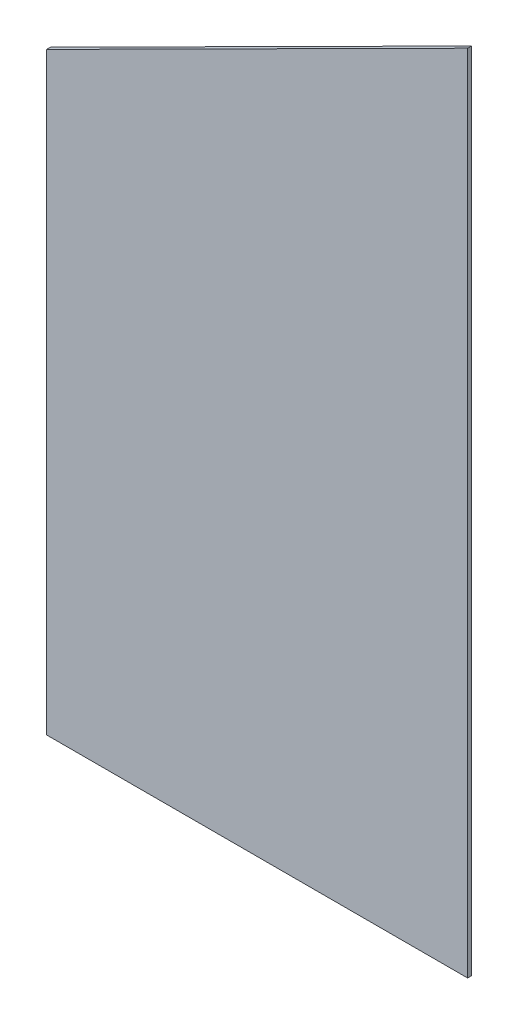
ISO-10303-21;
HEADER;
FILE_DESCRIPTION(('STEP AP214'),'2;1');
FILE_NAME('part.step','',(''),(''),'','','');
FILE_SCHEMA(('AUTOMOTIVE_DESIGN { 1 0 10303 214 1 1 1 1 }'));
ENDSEC;
DATA;
#1=APPLICATION_CONTEXT('core data for automotive mechanical design processes');
#2=APPLICATION_PROTOCOL_DEFINITION('international standard','automotive_design',2000,#1);
#3=PRODUCT_CONTEXT('',#1,'mechanical');
#4=PRODUCT('Part','Part','',(#3));
#5=PRODUCT_RELATED_PRODUCT_CATEGORY('part','',(#4));
#6=PRODUCT_DEFINITION_FORMATION('','',#4);
#7=PRODUCT_DEFINITION_CONTEXT('part definition',#1,'design');
#8=PRODUCT_DEFINITION('design','',#6,#7);
#9=PRODUCT_DEFINITION_SHAPE('','',#8);
#10=(LENGTH_UNIT() NAMED_UNIT(*) SI_UNIT(.MILLI.,.METRE.));
#11=(NAMED_UNIT(*) PLANE_ANGLE_UNIT() SI_UNIT($,.RADIAN.));
#12=(NAMED_UNIT(*) SI_UNIT($,.STERADIAN.) SOLID_ANGLE_UNIT());
#13=UNCERTAINTY_MEASURE_WITH_UNIT(LENGTH_MEASURE(1.E-05),#10,'distance_accuracy_value','');
#14=(GEOMETRIC_REPRESENTATION_CONTEXT(3) GLOBAL_UNCERTAINTY_ASSIGNED_CONTEXT((#13)) GLOBAL_UNIT_ASSIGNED_CONTEXT((#10,
#11,#12)) REPRESENTATION_CONTEXT('',''));
#15=CARTESIAN_POINT('',(0.,0.,0.));
#16=DIRECTION('',(0.,0.,1.));
#17=DIRECTION('',(1.,0.,0.));
#18=AXIS2_PLACEMENT_3D('',#15,#16,#17);
#19=CARTESIAN_POINT('',(-62.0731846702681,123.543716756931,2.));
#20=DIRECTION('',(-0.448956266195029,0.893553731481335,0.));
#21=DIRECTION('',(-0.893553731481335,-0.448956266195029,0.));
#22=AXIS2_PLACEMENT_3D('',#19,#20,#21);
#23=PLANE('',#22);
#24=DIRECTION('',(0.893553731481335,0.448956266195029,0.));
#25=VECTOR('',#24,1.);
#26=CARTESIAN_POINT('',(-62.0731846702681,123.543716756931,0.));
#27=LINE('',#26,#25);
#28=CARTESIAN_POINT('',(-109.606398469236,99.661175130636,0.));
#29=VERTEX_POINT('',#28);
#30=CARTESIAN_POINT('',(110.,210.,0.));
#31=VERTEX_POINT('',#30);
#32=EDGE_CURVE('E110',#29,#31,#27,.T.);
#33=ORIENTED_EDGE('',*,*,#32,.F.);
#34=DIRECTION('',(0.,0.,-1.));
#35=VECTOR('',#34,1.);
#36=CARTESIAN_POINT('',(-109.606398469236,99.661175130636,2.));
#37=LINE('',#36,#35);
#38=CARTESIAN_POINT('',(-109.606398469236,99.661175130636,2.));
#39=VERTEX_POINT('',#38);
#40=EDGE_CURVE('E11',#39,#29,#37,.T.);
#41=ORIENTED_EDGE('',*,*,#40,.F.);
#42=DIRECTION('',(0.893553731481335,0.448956266195029,0.));
#43=VECTOR('',#42,1.);
#44=CARTESIAN_POINT('',(-62.0731846702681,123.543716756931,2.));
#45=LINE('',#44,#43);
#46=CARTESIAN_POINT('',(110.,210.,2.));
#47=VERTEX_POINT('',#46);
#48=EDGE_CURVE('E101',#39,#47,#45,.T.);
#49=ORIENTED_EDGE('',*,*,#48,.T.);
#50=DIRECTION('',(0.,0.,-1.));
#51=VECTOR('',#50,1.);
#52=CARTESIAN_POINT('',(110.,210.,2.));
#53=LINE('',#52,#51);
#54=EDGE_CURVE('E80',#47,#31,#53,.T.);
#55=ORIENTED_EDGE('',*,*,#54,.T.);
#56=EDGE_LOOP('',(#33,#41,#49,#55));
#57=FACE_BOUND('',#56,.T.);
#58=ADVANCED_FACE('F41',(#57),#23,.T.);
#59=CARTESIAN_POINT('',(-109.606398469236,0.,2.));
#60=DIRECTION('',(-1.,0.,0.));
#61=DIRECTION('',(0.,0.,1.));
#62=AXIS2_PLACEMENT_3D('',#59,#60,#61);
#63=PLANE('',#62);
#64=DIRECTION('',(0.,1.,0.));
#65=VECTOR('',#64,1.);
#66=CARTESIAN_POINT('',(-109.606398469236,0.,0.));
#67=LINE('',#66,#65);
#68=CARTESIAN_POINT('',(-109.606398469236,-210.,0.));
#69=VERTEX_POINT('',#68);
#70=EDGE_CURVE('E93',#69,#29,#67,.T.);
#71=ORIENTED_EDGE('',*,*,#70,.F.);
#72=DIRECTION('',(0.,0.,-1.));
#73=VECTOR('',#72,1.);
#74=CARTESIAN_POINT('',(-109.606398469236,-210.,2.));
#75=LINE('',#74,#73);
#76=CARTESIAN_POINT('',(-109.606398469236,-210.,2.));
#77=VERTEX_POINT('',#76);
#78=EDGE_CURVE('E50',#77,#69,#75,.T.);
#79=ORIENTED_EDGE('',*,*,#78,.F.);
#80=DIRECTION('',(0.,1.,0.));
#81=VECTOR('',#80,1.);
#82=CARTESIAN_POINT('',(-109.606398469236,0.,2.));
#83=LINE('',#82,#81);
#84=EDGE_CURVE('E91',#77,#39,#83,.T.);
#85=ORIENTED_EDGE('',*,*,#84,.T.);
#86=ORIENTED_EDGE('',*,*,#40,.T.);
#87=EDGE_LOOP('',(#71,#79,#85,#86));
#88=FACE_BOUND('',#87,.T.);
#89=ADVANCED_FACE('F89',(#88),#63,.T.);
#90=CARTESIAN_POINT('',(0.,-210.,2.));
#91=DIRECTION('',(0.,1.,0.));
#92=DIRECTION('',(-1.,0.,0.));
#93=AXIS2_PLACEMENT_3D('',#90,#91,#92);
#94=PLANE('',#93);
#95=DIRECTION('',(1.,0.,0.));
#96=VECTOR('',#95,1.);
#97=CARTESIAN_POINT('',(0.,-210.,0.));
#98=LINE('',#97,#96);
#99=CARTESIAN_POINT('',(110.,-210.,0.));
#100=VERTEX_POINT('',#99);
#101=EDGE_CURVE('E73',#69,#100,#98,.T.);
#102=ORIENTED_EDGE('',*,*,#101,.T.);
#103=DIRECTION('',(0.,0.,-1.));
#104=VECTOR('',#103,1.);
#105=CARTESIAN_POINT('',(110.,-210.,2.));
#106=LINE('',#105,#104);
#107=CARTESIAN_POINT('',(110.,-210.,2.));
#108=VERTEX_POINT('',#107);
#109=EDGE_CURVE('E95',#108,#100,#106,.T.);
#110=ORIENTED_EDGE('',*,*,#109,.F.);
#111=DIRECTION('',(1.,0.,0.));
#112=VECTOR('',#111,1.);
#113=CARTESIAN_POINT('',(0.,-210.,2.));
#114=LINE('',#113,#112);
#115=EDGE_CURVE('E96',#77,#108,#114,.T.);
#116=ORIENTED_EDGE('',*,*,#115,.F.);
#117=ORIENTED_EDGE('',*,*,#78,.T.);
#118=EDGE_LOOP('',(#102,#110,#116,#117));
#119=FACE_BOUND('',#118,.T.);
#120=ADVANCED_FACE('F97',(#119),#94,.F.);
#121=CARTESIAN_POINT('',(110.,0.,2.));
#122=DIRECTION('',(-1.,0.,0.));
#123=DIRECTION('',(0.,0.,1.));
#124=AXIS2_PLACEMENT_3D('',#121,#122,#123);
#125=PLANE('',#124);
#126=DIRECTION('',(0.,1.,0.));
#127=VECTOR('',#126,1.);
#128=CARTESIAN_POINT('',(110.,0.,0.));
#129=LINE('',#128,#127);
#130=EDGE_CURVE('E105',#100,#31,#129,.T.);
#131=ORIENTED_EDGE('',*,*,#130,.T.);
#132=ORIENTED_EDGE('',*,*,#54,.F.);
#133=DIRECTION('',(0.,1.,0.));
#134=VECTOR('',#133,1.);
#135=CARTESIAN_POINT('',(110.,0.,2.));
#136=LINE('',#135,#134);
#137=EDGE_CURVE('E58',#108,#47,#136,.T.);
#138=ORIENTED_EDGE('',*,*,#137,.F.);
#139=ORIENTED_EDGE('',*,*,#109,.T.);
#140=EDGE_LOOP('',(#131,#132,#138,#139));
#141=FACE_BOUND('',#140,.T.);
#142=ADVANCED_FACE('F125',(#141),#125,.F.);
#143=CARTESIAN_POINT('',(0.,0.,2.));
#144=DIRECTION('',(0.,0.,1.));
#145=DIRECTION('',(1.,0.,0.));
#146=AXIS2_PLACEMENT_3D('',#143,#144,#145);
#147=PLANE('',#146);
#148=ORIENTED_EDGE('',*,*,#48,.F.);
#149=ORIENTED_EDGE('',*,*,#84,.F.);
#150=ORIENTED_EDGE('',*,*,#115,.T.);
#151=ORIENTED_EDGE('',*,*,#137,.T.);
#152=EDGE_LOOP('',(#148,#149,#150,#151));
#153=FACE_BOUND('',#152,.T.);
#154=ADVANCED_FACE('F100',(#153),#147,.T.);
#155=CARTESIAN_POINT('',(0.,0.,0.));
#156=DIRECTION('',(0.,0.,1.));
#157=DIRECTION('',(1.,0.,0.));
#158=AXIS2_PLACEMENT_3D('',#155,#156,#157);
#159=PLANE('',#158);
#160=ORIENTED_EDGE('',*,*,#32,.T.);
#161=ORIENTED_EDGE('',*,*,#130,.F.);
#162=ORIENTED_EDGE('',*,*,#101,.F.);
#163=ORIENTED_EDGE('',*,*,#70,.T.);
#164=EDGE_LOOP('',(#160,#161,#162,#163));
#165=FACE_BOUND('',#164,.T.);
#166=ADVANCED_FACE('F127',(#165),#159,.F.);
#167=CLOSED_SHELL('',(#58,#89,#120,#142,#154,#166));
#168=MANIFOLD_SOLID_BREP('B2',#167);
#169=ADVANCED_BREP_SHAPE_REPRESENTATION('',(#18,#168),#14);
#170=SHAPE_DEFINITION_REPRESENTATION(#9,#169);
ENDSEC;
END-ISO-10303-21;
